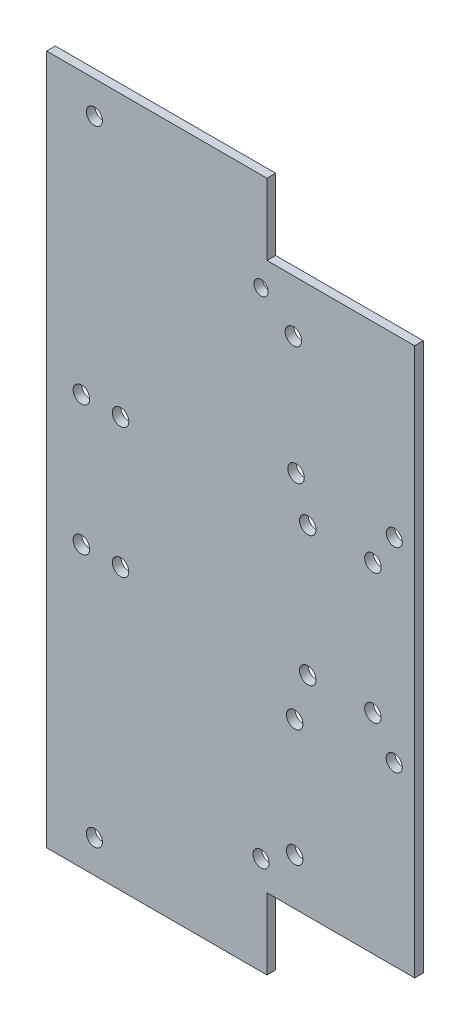
ISO-10303-21;
HEADER;
FILE_DESCRIPTION(('STEP AP214'),'2;1');
FILE_NAME('part.step','',(''),(''),'','','');
FILE_SCHEMA(('AUTOMOTIVE_DESIGN { 1 0 10303 214 1 1 1 1 }'));
ENDSEC;
DATA;
#1=APPLICATION_CONTEXT('core data for automotive mechanical design processes');
#2=APPLICATION_PROTOCOL_DEFINITION('international standard','automotive_design',2000,#1);
#3=PRODUCT_CONTEXT('',#1,'mechanical');
#4=PRODUCT('Part','Part','',(#3));
#5=PRODUCT_RELATED_PRODUCT_CATEGORY('part','',(#4));
#6=PRODUCT_DEFINITION_FORMATION('','',#4);
#7=PRODUCT_DEFINITION_CONTEXT('part definition',#1,'design');
#8=PRODUCT_DEFINITION('design','',#6,#7);
#9=PRODUCT_DEFINITION_SHAPE('','',#8);
#10=(LENGTH_UNIT() NAMED_UNIT(*) SI_UNIT(.MILLI.,.METRE.));
#11=(NAMED_UNIT(*) PLANE_ANGLE_UNIT() SI_UNIT($,.RADIAN.));
#12=(NAMED_UNIT(*) SI_UNIT($,.STERADIAN.) SOLID_ANGLE_UNIT());
#13=UNCERTAINTY_MEASURE_WITH_UNIT(LENGTH_MEASURE(1.E-05),#10,'distance_accuracy_value','');
#14=(GEOMETRIC_REPRESENTATION_CONTEXT(3) GLOBAL_UNCERTAINTY_ASSIGNED_CONTEXT((#13)) GLOBAL_UNIT_ASSIGNED_CONTEXT((#10,
#11,#12)) REPRESENTATION_CONTEXT('',''));
#15=CARTESIAN_POINT('',(0.,0.,0.));
#16=DIRECTION('',(0.,0.,1.));
#17=DIRECTION('',(1.,0.,0.));
#18=AXIS2_PLACEMENT_3D('',#15,#16,#17);
#19=CARTESIAN_POINT('',(0.,0.,2.54));
#20=DIRECTION('',(0.,0.,1.));
#21=DIRECTION('',(1.,0.,0.));
#22=AXIS2_PLACEMENT_3D('',#19,#20,#21);
#23=PLANE('',#22);
#24=DIRECTION('',(0.,-1.,0.));
#25=VECTOR('',#24,1.);
#26=CARTESIAN_POINT('',(-104.617436481074,-66.5367810750292,2.54));
#27=LINE('',#26,#25);
#28=CARTESIAN_POINT('',(-104.617436481074,12.1397189249708,2.54));
#29=VERTEX_POINT('',#28);
#30=CARTESIAN_POINT('',(-104.617436481074,-189.536281075029,2.54));
#31=VERTEX_POINT('',#30);
#32=EDGE_CURVE('E106',#29,#31,#27,.T.);
#33=ORIENTED_EDGE('',*,*,#32,.T.);
#34=DIRECTION('',(1.,0.,0.));
#35=VECTOR('',#34,1.);
#36=CARTESIAN_POINT('',(-143.497061780672,-189.536281075029,2.54));
#37=LINE('',#36,#35);
#38=CARTESIAN_POINT('',(-40.2334284748819,-189.536281075029,2.54));
#39=VERTEX_POINT('',#38);
#40=EDGE_CURVE('E110',#31,#39,#37,.T.);
#41=ORIENTED_EDGE('',*,*,#40,.T.);
#42=DIRECTION('',(0.,-1.,0.));
#43=VECTOR('',#42,1.);
#44=CARTESIAN_POINT('',(-40.2334284748819,-197.669221200133,2.54));
#45=LINE('',#44,#43);
#46=CARTESIAN_POINT('',(-40.2334284748819,-168.708281075029,2.54));
#47=VERTEX_POINT('',#46);
#48=EDGE_CURVE('E163',#47,#39,#45,.T.);
#49=ORIENTED_EDGE('',*,*,#48,.F.);
#50=DIRECTION('',(1.,0.,0.));
#51=VECTOR('',#50,1.);
#52=CARTESIAN_POINT('',(2.93005005933537,-168.708281075029,2.54));
#53=LINE('',#52,#51);
#54=CARTESIAN_POINT('',(2.93005005933537,-168.708281075029,2.54));
#55=VERTEX_POINT('',#54);
#56=EDGE_CURVE('E125',#47,#55,#53,.T.);
#57=ORIENTED_EDGE('',*,*,#56,.T.);
#58=DIRECTION('',(0.,1.,0.));
#59=VECTOR('',#58,1.);
#60=CARTESIAN_POINT('',(2.93005005933537,-168.708281075029,2.54));
#61=LINE('',#60,#59);
#62=CARTESIAN_POINT('',(2.93005005933538,-8.68828107502921,2.54));
#63=VERTEX_POINT('',#62);
#64=EDGE_CURVE('E146',#55,#63,#61,.T.);
#65=ORIENTED_EDGE('',*,*,#64,.T.);
#66=DIRECTION('',(-1.,0.,0.));
#67=VECTOR('',#66,1.);
#68=CARTESIAN_POINT('',(2.93005005933538,-8.68828107502921,2.54));
#69=LINE('',#68,#67);
#70=CARTESIAN_POINT('',(-40.2334284748819,-8.68828107502921,2.54));
#71=VERTEX_POINT('',#70);
#72=EDGE_CURVE('E129',#63,#71,#69,.T.);
#73=ORIENTED_EDGE('',*,*,#72,.T.);
#74=DIRECTION('',(0.,-1.,0.));
#75=VECTOR('',#74,1.);
#76=CARTESIAN_POINT('',(-40.2334284748819,12.425225660702,2.54));
#77=LINE('',#76,#75);
#78=CARTESIAN_POINT('',(-40.2334284748819,12.1397189249708,2.54));
#79=VERTEX_POINT('',#78);
#80=EDGE_CURVE('E170',#79,#71,#77,.T.);
#81=ORIENTED_EDGE('',*,*,#80,.F.);
#82=DIRECTION('',(-1.,0.,0.));
#83=VECTOR('',#82,1.);
#84=CARTESIAN_POINT('',(-143.497061780672,12.1397189249708,2.54));
#85=LINE('',#84,#83);
#86=EDGE_CURVE('E114',#79,#29,#85,.T.);
#87=ORIENTED_EDGE('',*,*,#86,.T.);
#88=EDGE_LOOP('',(#33,#41,#49,#57,#65,#73,#81,#87));
#89=FACE_BOUND('',#88,.T.);
#90=CARTESIAN_POINT('',(-32.1404679928819,-155.071444628745,2.54));
#91=DIRECTION('',(0.,0.,1.));
#92=DIRECTION('',(1.,0.,0.));
#93=AXIS2_PLACEMENT_3D('',#90,#91,#92);
#94=CIRCLE('',#93,2.41300000000001);
#95=CARTESIAN_POINT('',(-29.7274679928819,-155.071444628745,2.54));
#96=VERTEX_POINT('',#95);
#97=EDGE_CURVE('E183',#96,#96,#94,.T.);
#98=ORIENTED_EDGE('',*,*,#97,.F.);
#99=EDGE_LOOP('',(#98));
#100=FACE_BOUND('',#99,.T.);
#101=CARTESIAN_POINT('',(-32.1404679928819,-120.781444628745,2.54));
#102=DIRECTION('',(0.,0.,1.));
#103=DIRECTION('',(1.,0.,0.));
#104=AXIS2_PLACEMENT_3D('',#101,#102,#103);
#105=CIRCLE('',#104,2.413);
#106=CARTESIAN_POINT('',(-29.7274679928819,-120.781444628745,2.54));
#107=VERTEX_POINT('',#106);
#108=EDGE_CURVE('E175',#107,#107,#105,.T.);
#109=ORIENTED_EDGE('',*,*,#108,.F.);
#110=EDGE_LOOP('',(#109));
#111=FACE_BOUND('',#110,.T.);
#112=CARTESIAN_POINT('',(-32.5113958305303,-23.9917810750292,2.54));
#113=DIRECTION('',(0.,0.,1.));
#114=DIRECTION('',(1.,0.,0.));
#115=AXIS2_PLACEMENT_3D('',#112,#113,#114);
#116=CIRCLE('',#115,2.413);
#117=CARTESIAN_POINT('',(-30.0983958305303,-23.9917810750292,2.54));
#118=VERTEX_POINT('',#117);
#119=EDGE_CURVE('E182',#118,#118,#116,.T.);
#120=ORIENTED_EDGE('',*,*,#119,.F.);
#121=EDGE_LOOP('',(#120));
#122=FACE_BOUND('',#121,.T.);
#123=CARTESIAN_POINT('',(-31.7389916341588,-58.2730805217748,2.54));
#124=DIRECTION('',(0.,0.,1.));
#125=DIRECTION('',(1.,0.,0.));
#126=AXIS2_PLACEMENT_3D('',#123,#124,#125);
#127=CIRCLE('',#126,2.41299999999999);
#128=CARTESIAN_POINT('',(-29.3259916341588,-58.2730805217748,2.54));
#129=VERTEX_POINT('',#128);
#130=EDGE_CURVE('E194',#129,#129,#127,.T.);
#131=ORIENTED_EDGE('',*,*,#130,.F.);
#132=EDGE_LOOP('',(#131));
#133=FACE_BOUND('',#132,.T.);
#134=CARTESIAN_POINT('',(-83.0274364810743,-69.7117810750292,2.54));
#135=DIRECTION('',(0.,0.,1.));
#136=DIRECTION('',(1.,0.,0.));
#137=AXIS2_PLACEMENT_3D('',#134,#135,#136);
#138=CIRCLE('',#137,2.41299999999999);
#139=CARTESIAN_POINT('',(-80.6144364810743,-69.7117810750292,2.54));
#140=VERTEX_POINT('',#139);
#141=EDGE_CURVE('E221',#140,#140,#138,.T.);
#142=ORIENTED_EDGE('',*,*,#141,.F.);
#143=EDGE_LOOP('',(#142));
#144=FACE_BOUND('',#143,.T.);
#145=CARTESIAN_POINT('',(-28.3119499406647,-69.7117810750292,2.54));
#146=DIRECTION('',(0.,0.,1.));
#147=DIRECTION('',(1.,0.,0.));
#148=AXIS2_PLACEMENT_3D('',#145,#146,#147);
#149=CIRCLE('',#148,2.413);
#150=CARTESIAN_POINT('',(-25.8989499406647,-69.7117810750292,2.54));
#151=VERTEX_POINT('',#150);
#152=EDGE_CURVE('E228',#151,#151,#149,.T.);
#153=ORIENTED_EDGE('',*,*,#152,.F.);
#154=EDGE_LOOP('',(#153));
#155=FACE_BOUND('',#154,.T.);
#156=CARTESIAN_POINT('',(-9.26194994066465,-69.7117810750292,2.54));
#157=DIRECTION('',(0.,0.,1.));
#158=DIRECTION('',(1.,0.,0.));
#159=AXIS2_PLACEMENT_3D('',#156,#157,#158);
#160=CIRCLE('',#159,2.413);
#161=CARTESIAN_POINT('',(-6.84894994066465,-69.7117810750292,2.54));
#162=VERTEX_POINT('',#161);
#163=EDGE_CURVE('E234',#162,#162,#160,.T.);
#164=ORIENTED_EDGE('',*,*,#163,.F.);
#165=EDGE_LOOP('',(#164));
#166=FACE_BOUND('',#165,.T.);
#167=CARTESIAN_POINT('',(-28.3119499406647,-107.684781075029,2.54));
#168=DIRECTION('',(0.,0.,-1.));
#169=DIRECTION('',(-1.,0.,0.));
#170=AXIS2_PLACEMENT_3D('',#167,#168,#169);
#171=CIRCLE('',#170,2.413);
#172=CARTESIAN_POINT('',(-30.7249499406647,-107.684781075029,2.54));
#173=VERTEX_POINT('',#172);
#174=EDGE_CURVE('E203',#173,#173,#171,.T.);
#175=ORIENTED_EDGE('',*,*,#174,.T.);
#176=EDGE_LOOP('',(#175));
#177=FACE_BOUND('',#176,.T.);
#178=CARTESIAN_POINT('',(-94.4574364810743,-107.684781075029,2.54));
#179=DIRECTION('',(0.,0.,-1.));
#180=DIRECTION('',(-1.,0.,0.));
#181=AXIS2_PLACEMENT_3D('',#178,#179,#180);
#182=CIRCLE('',#181,2.413);
#183=CARTESIAN_POINT('',(-96.8704364810743,-107.684781075029,2.54));
#184=VERTEX_POINT('',#183);
#185=EDGE_CURVE('E216',#184,#184,#182,.T.);
#186=ORIENTED_EDGE('',*,*,#185,.T.);
#187=EDGE_LOOP('',(#186));
#188=FACE_BOUND('',#187,.T.);
#189=CARTESIAN_POINT('',(-94.4574364810743,-69.7117810750292,2.54));
#190=DIRECTION('',(0.,0.,1.));
#191=DIRECTION('',(1.,0.,0.));
#192=AXIS2_PLACEMENT_3D('',#189,#190,#191);
#193=CIRCLE('',#192,2.41299999999999);
#194=CARTESIAN_POINT('',(-92.0444364810743,-69.7117810750292,2.54));
#195=VERTEX_POINT('',#194);
#196=EDGE_CURVE('E224',#195,#195,#193,.T.);
#197=ORIENTED_EDGE('',*,*,#196,.F.);
#198=EDGE_LOOP('',(#197));
#199=FACE_BOUND('',#198,.T.);
#200=CARTESIAN_POINT('',(-3.03506178067245,-60.1867810750292,2.54));
#201=DIRECTION('',(0.,0.,1.));
#202=DIRECTION('',(1.,0.,0.));
#203=AXIS2_PLACEMENT_3D('',#200,#201,#202);
#204=CIRCLE('',#203,2.3495);
#205=CARTESIAN_POINT('',(-0.685561780672452,-60.1867810750292,2.54));
#206=VERTEX_POINT('',#205);
#207=EDGE_CURVE('E255',#206,#206,#204,.T.);
#208=ORIENTED_EDGE('',*,*,#207,.F.);
#209=EDGE_LOOP('',(#208));
#210=FACE_BOUND('',#209,.T.);
#211=CARTESIAN_POINT('',(-90.6739111427951,2.61471892497078,2.54));
#212=DIRECTION('',(0.,0.,1.));
#213=DIRECTION('',(1.,0.,0.));
#214=AXIS2_PLACEMENT_3D('',#211,#212,#213);
#215=CIRCLE('',#214,2.3495);
#216=CARTESIAN_POINT('',(-88.3244111427951,2.61471892497078,2.54));
#217=VERTEX_POINT('',#216);
#218=EDGE_CURVE('E267',#217,#217,#215,.T.);
#219=ORIENTED_EDGE('',*,*,#218,.F.);
#220=EDGE_LOOP('',(#219));
#221=FACE_BOUND('',#220,.T.);
#222=CARTESIAN_POINT('',(-41.9565544799439,-160.961281075029,2.54));
#223=DIRECTION('',(0.,0.,1.));
#224=DIRECTION('',(1.,0.,0.));
#225=AXIS2_PLACEMENT_3D('',#222,#223,#224);
#226=CIRCLE('',#225,2.3495);
#227=CARTESIAN_POINT('',(-39.6070544799439,-160.961281075029,2.54));
#228=VERTEX_POINT('',#227);
#229=EDGE_CURVE('E137',#228,#228,#226,.T.);
#230=ORIENTED_EDGE('',*,*,#229,.F.);
#231=EDGE_LOOP('',(#230));
#232=FACE_BOUND('',#231,.T.);
#233=CARTESIAN_POINT('',(-90.6739111427951,-180.011281075029,2.54));
#234=DIRECTION('',(0.,0.,1.));
#235=DIRECTION('',(1.,0.,0.));
#236=AXIS2_PLACEMENT_3D('',#233,#234,#235);
#237=CIRCLE('',#236,2.34950000000001);
#238=CARTESIAN_POINT('',(-88.3244111427951,-180.011281075029,2.54));
#239=VERTEX_POINT('',#238);
#240=EDGE_CURVE('E273',#239,#239,#237,.T.);
#241=ORIENTED_EDGE('',*,*,#240,.F.);
#242=EDGE_LOOP('',(#241));
#243=FACE_BOUND('',#242,.T.);
#244=CARTESIAN_POINT('',(-3.03506178067245,-117.209781075029,2.54));
#245=DIRECTION('',(0.,0.,1.));
#246=DIRECTION('',(1.,0.,0.));
#247=AXIS2_PLACEMENT_3D('',#244,#245,#246);
#248=CIRCLE('',#247,2.3495);
#249=CARTESIAN_POINT('',(-0.685561780672452,-117.209781075029,2.54));
#250=VERTEX_POINT('',#249);
#251=EDGE_CURVE('E261',#250,#250,#248,.T.);
#252=ORIENTED_EDGE('',*,*,#251,.F.);
#253=EDGE_LOOP('',(#252));
#254=FACE_BOUND('',#253,.T.);
#255=CARTESIAN_POINT('',(-41.9565544799439,-16.4352810750292,2.54));
#256=DIRECTION('',(0.,0.,1.));
#257=DIRECTION('',(1.,0.,0.));
#258=AXIS2_PLACEMENT_3D('',#255,#256,#257);
#259=CIRCLE('',#258,2.0955);
#260=CARTESIAN_POINT('',(-39.8610544799439,-16.4352810750292,2.54));
#261=VERTEX_POINT('',#260);
#262=EDGE_CURVE('E249',#261,#261,#259,.T.);
#263=ORIENTED_EDGE('',*,*,#262,.F.);
#264=EDGE_LOOP('',(#263));
#265=FACE_BOUND('',#264,.T.);
#266=CARTESIAN_POINT('',(-83.0274364810744,-107.684781075029,2.54));
#267=DIRECTION('',(0.,0.,-1.));
#268=DIRECTION('',(-1.,0.,0.));
#269=AXIS2_PLACEMENT_3D('',#266,#267,#268);
#270=CIRCLE('',#269,2.41299999999999);
#271=CARTESIAN_POINT('',(-85.4404364810744,-107.684781075029,2.54));
#272=VERTEX_POINT('',#271);
#273=EDGE_CURVE('E210',#272,#272,#270,.T.);
#274=ORIENTED_EDGE('',*,*,#273,.T.);
#275=EDGE_LOOP('',(#274));
#276=FACE_BOUND('',#275,.T.);
#277=CARTESIAN_POINT('',(-9.26194994066465,-107.684781075029,2.54));
#278=DIRECTION('',(0.,0.,-1.));
#279=DIRECTION('',(-1.,0.,0.));
#280=AXIS2_PLACEMENT_3D('',#277,#278,#279);
#281=CIRCLE('',#280,2.41299999999999);
#282=CARTESIAN_POINT('',(-11.6749499406646,-107.684781075029,2.54));
#283=VERTEX_POINT('',#282);
#284=EDGE_CURVE('E240',#283,#283,#281,.T.);
#285=ORIENTED_EDGE('',*,*,#284,.T.);
#286=EDGE_LOOP('',(#285));
#287=FACE_BOUND('',#286,.T.);
#288=ADVANCED_FACE('F41',(#89,#100,#111,#122,#133,#144,#155,#166,#177,#188,#199,#210,#221,#232,
#243,#254,#265,#276,#287),#23,.T.);
#289=CARTESIAN_POINT('',(0.,0.,0.));
#290=DIRECTION('',(0.,0.,1.));
#291=DIRECTION('',(1.,0.,0.));
#292=AXIS2_PLACEMENT_3D('',#289,#290,#291);
#293=PLANE('',#292);
#294=CARTESIAN_POINT('',(-32.1404679928819,-155.071444628745,0.));
#295=DIRECTION('',(0.,0.,1.));
#296=DIRECTION('',(1.,0.,0.));
#297=AXIS2_PLACEMENT_3D('',#294,#295,#296);
#298=CIRCLE('',#297,2.41300000000001);
#299=CARTESIAN_POINT('',(-29.7274679928819,-155.071444628745,0.));
#300=VERTEX_POINT('',#299);
#301=EDGE_CURVE('E179',#300,#300,#298,.T.);
#302=ORIENTED_EDGE('',*,*,#301,.T.);
#303=EDGE_LOOP('',(#302));
#304=FACE_BOUND('',#303,.T.);
#305=CARTESIAN_POINT('',(-32.1404679928819,-120.781444628745,0.));
#306=DIRECTION('',(0.,0.,1.));
#307=DIRECTION('',(1.,0.,0.));
#308=AXIS2_PLACEMENT_3D('',#305,#306,#307);
#309=CIRCLE('',#308,2.413);
#310=CARTESIAN_POINT('',(-29.7274679928819,-120.781444628745,0.));
#311=VERTEX_POINT('',#310);
#312=EDGE_CURVE('E186',#311,#311,#309,.T.);
#313=ORIENTED_EDGE('',*,*,#312,.T.);
#314=EDGE_LOOP('',(#313));
#315=FACE_BOUND('',#314,.T.);
#316=CARTESIAN_POINT('',(-32.5113958305303,-23.9917810750292,0.));
#317=DIRECTION('',(0.,0.,1.));
#318=DIRECTION('',(1.,0.,0.));
#319=AXIS2_PLACEMENT_3D('',#316,#317,#318);
#320=CIRCLE('',#319,2.413);
#321=CARTESIAN_POINT('',(-30.0983958305303,-23.9917810750292,0.));
#322=VERTEX_POINT('',#321);
#323=EDGE_CURVE('E191',#322,#322,#320,.T.);
#324=ORIENTED_EDGE('',*,*,#323,.T.);
#325=EDGE_LOOP('',(#324));
#326=FACE_BOUND('',#325,.T.);
#327=CARTESIAN_POINT('',(-31.7389916341588,-58.2730805217748,0.));
#328=DIRECTION('',(0.,0.,1.));
#329=DIRECTION('',(1.,0.,0.));
#330=AXIS2_PLACEMENT_3D('',#327,#328,#329);
#331=CIRCLE('',#330,2.41299999999999);
#332=CARTESIAN_POINT('',(-29.3259916341588,-58.2730805217748,0.));
#333=VERTEX_POINT('',#332);
#334=EDGE_CURVE('E197',#333,#333,#331,.T.);
#335=ORIENTED_EDGE('',*,*,#334,.T.);
#336=EDGE_LOOP('',(#335));
#337=FACE_BOUND('',#336,.T.);
#338=CARTESIAN_POINT('',(-83.0274364810743,-69.7117810750292,0.));
#339=DIRECTION('',(0.,0.,1.));
#340=DIRECTION('',(1.,0.,0.));
#341=AXIS2_PLACEMENT_3D('',#338,#339,#340);
#342=CIRCLE('',#341,2.41299999999999);
#343=CARTESIAN_POINT('',(-80.6144364810743,-69.7117810750292,0.));
#344=VERTEX_POINT('',#343);
#345=EDGE_CURVE('E225',#344,#344,#342,.T.);
#346=ORIENTED_EDGE('',*,*,#345,.T.);
#347=EDGE_LOOP('',(#346));
#348=FACE_BOUND('',#347,.T.);
#349=CARTESIAN_POINT('',(-28.3119499406647,-69.7117810750292,0.));
#350=DIRECTION('',(0.,0.,1.));
#351=DIRECTION('',(1.,0.,0.));
#352=AXIS2_PLACEMENT_3D('',#349,#350,#351);
#353=CIRCLE('',#352,2.413);
#354=CARTESIAN_POINT('',(-25.8989499406647,-69.7117810750292,0.));
#355=VERTEX_POINT('',#354);
#356=EDGE_CURVE('E231',#355,#355,#353,.T.);
#357=ORIENTED_EDGE('',*,*,#356,.T.);
#358=EDGE_LOOP('',(#357));
#359=FACE_BOUND('',#358,.T.);
#360=CARTESIAN_POINT('',(-9.26194994066465,-69.7117810750292,0.));
#361=DIRECTION('',(0.,0.,1.));
#362=DIRECTION('',(1.,0.,0.));
#363=AXIS2_PLACEMENT_3D('',#360,#361,#362);
#364=CIRCLE('',#363,2.413);
#365=CARTESIAN_POINT('',(-6.84894994066465,-69.7117810750292,0.));
#366=VERTEX_POINT('',#365);
#367=EDGE_CURVE('E237',#366,#366,#364,.T.);
#368=ORIENTED_EDGE('',*,*,#367,.T.);
#369=EDGE_LOOP('',(#368));
#370=FACE_BOUND('',#369,.T.);
#371=CARTESIAN_POINT('',(-94.4574364810743,-69.7117810750292,0.));
#372=DIRECTION('',(0.,0.,1.));
#373=DIRECTION('',(1.,0.,0.));
#374=AXIS2_PLACEMENT_3D('',#371,#372,#373);
#375=CIRCLE('',#374,2.41299999999999);
#376=CARTESIAN_POINT('',(-92.0444364810743,-69.7117810750292,0.));
#377=VERTEX_POINT('',#376);
#378=EDGE_CURVE('E116',#377,#377,#375,.T.);
#379=ORIENTED_EDGE('',*,*,#378,.T.);
#380=EDGE_LOOP('',(#379));
#381=FACE_BOUND('',#380,.T.);
#382=DIRECTION('',(1.,0.,0.));
#383=VECTOR('',#382,1.);
#384=CARTESIAN_POINT('',(-143.497061780672,-189.536281075029,0.));
#385=LINE('',#384,#383);
#386=CARTESIAN_POINT('',(-104.617436481074,-189.536281075029,0.));
#387=VERTEX_POINT('',#386);
#388=CARTESIAN_POINT('',(-40.2334284748819,-189.536281075029,0.));
#389=VERTEX_POINT('',#388);
#390=EDGE_CURVE('E142',#387,#389,#385,.T.);
#391=ORIENTED_EDGE('',*,*,#390,.F.);
#392=DIRECTION('',(0.,1.,0.));
#393=VECTOR('',#392,1.);
#394=CARTESIAN_POINT('',(-104.617436481074,-66.5367810750292,0.));
#395=LINE('',#394,#393);
#396=CARTESIAN_POINT('',(-104.617436481074,12.1397189249708,0.));
#397=VERTEX_POINT('',#396);
#398=EDGE_CURVE('E56',#387,#397,#395,.T.);
#399=ORIENTED_EDGE('',*,*,#398,.T.);
#400=DIRECTION('',(-1.,0.,0.));
#401=VECTOR('',#400,1.);
#402=CARTESIAN_POINT('',(-143.497061780672,12.1397189249708,0.));
#403=LINE('',#402,#401);
#404=CARTESIAN_POINT('',(-40.2334284748819,12.1397189249708,0.));
#405=VERTEX_POINT('',#404);
#406=EDGE_CURVE('E139',#405,#397,#403,.T.);
#407=ORIENTED_EDGE('',*,*,#406,.F.);
#408=DIRECTION('',(0.,-1.,0.));
#409=VECTOR('',#408,1.);
#410=CARTESIAN_POINT('',(-40.2334284748819,12.425225660702,0.));
#411=LINE('',#410,#409);
#412=CARTESIAN_POINT('',(-40.2334284748819,-8.68828107502921,0.));
#413=VERTEX_POINT('',#412);
#414=EDGE_CURVE('E63',#405,#413,#411,.T.);
#415=ORIENTED_EDGE('',*,*,#414,.T.);
#416=DIRECTION('',(-1.,0.,0.));
#417=VECTOR('',#416,1.);
#418=CARTESIAN_POINT('',(2.93005005933538,-8.68828107502921,0.));
#419=LINE('',#418,#417);
#420=CARTESIAN_POINT('',(2.93005005933538,-8.68828107502921,0.));
#421=VERTEX_POINT('',#420);
#422=EDGE_CURVE('E136',#421,#413,#419,.T.);
#423=ORIENTED_EDGE('',*,*,#422,.F.);
#424=DIRECTION('',(0.,1.,0.));
#425=VECTOR('',#424,1.);
#426=CARTESIAN_POINT('',(2.93005005933537,-168.708281075029,0.));
#427=LINE('',#426,#425);
#428=CARTESIAN_POINT('',(2.93005005933537,-168.708281075029,0.));
#429=VERTEX_POINT('',#428);
#430=EDGE_CURVE('E133',#429,#421,#427,.T.);
#431=ORIENTED_EDGE('',*,*,#430,.F.);
#432=DIRECTION('',(1.,0.,0.));
#433=VECTOR('',#432,1.);
#434=CARTESIAN_POINT('',(2.93005005933537,-168.708281075029,0.));
#435=LINE('',#434,#433);
#436=CARTESIAN_POINT('',(-40.2334284748819,-168.708281075029,0.));
#437=VERTEX_POINT('',#436);
#438=EDGE_CURVE('E144',#437,#429,#435,.T.);
#439=ORIENTED_EDGE('',*,*,#438,.F.);
#440=DIRECTION('',(0.,-1.,0.));
#441=VECTOR('',#440,1.);
#442=CARTESIAN_POINT('',(-40.2334284748819,-197.669221200133,0.));
#443=LINE('',#442,#441);
#444=EDGE_CURVE('E165',#437,#389,#443,.T.);
#445=ORIENTED_EDGE('',*,*,#444,.T.);
#446=EDGE_LOOP('',(#391,#399,#407,#415,#423,#431,#439,#445));
#447=FACE_BOUND('',#446,.T.);
#448=CARTESIAN_POINT('',(-41.9565544799439,-160.961281075029,0.));
#449=DIRECTION('',(0.,0.,1.));
#450=DIRECTION('',(1.,0.,0.));
#451=AXIS2_PLACEMENT_3D('',#448,#449,#450);
#452=CIRCLE('',#451,2.3495);
#453=CARTESIAN_POINT('',(-39.6070544799439,-160.961281075029,0.));
#454=VERTEX_POINT('',#453);
#455=EDGE_CURVE('E276',#454,#454,#452,.T.);
#456=ORIENTED_EDGE('',*,*,#455,.T.);
#457=EDGE_LOOP('',(#456));
#458=FACE_BOUND('',#457,.T.);
#459=CARTESIAN_POINT('',(-90.6739111427951,-180.011281075029,0.));
#460=DIRECTION('',(0.,0.,1.));
#461=DIRECTION('',(1.,0.,0.));
#462=AXIS2_PLACEMENT_3D('',#459,#460,#461);
#463=CIRCLE('',#462,2.34950000000001);
#464=CARTESIAN_POINT('',(-88.3244111427951,-180.011281075029,0.));
#465=VERTEX_POINT('',#464);
#466=EDGE_CURVE('E270',#465,#465,#463,.T.);
#467=ORIENTED_EDGE('',*,*,#466,.T.);
#468=EDGE_LOOP('',(#467));
#469=FACE_BOUND('',#468,.T.);
#470=CARTESIAN_POINT('',(-90.6739111427951,2.61471892497078,0.));
#471=DIRECTION('',(0.,0.,1.));
#472=DIRECTION('',(1.,0.,0.));
#473=AXIS2_PLACEMENT_3D('',#470,#471,#472);
#474=CIRCLE('',#473,2.3495);
#475=CARTESIAN_POINT('',(-88.3244111427951,2.61471892497078,0.));
#476=VERTEX_POINT('',#475);
#477=EDGE_CURVE('E264',#476,#476,#474,.T.);
#478=ORIENTED_EDGE('',*,*,#477,.T.);
#479=EDGE_LOOP('',(#478));
#480=FACE_BOUND('',#479,.T.);
#481=CARTESIAN_POINT('',(-3.03506178067245,-117.209781075029,0.));
#482=DIRECTION('',(0.,0.,1.));
#483=DIRECTION('',(1.,0.,0.));
#484=AXIS2_PLACEMENT_3D('',#481,#482,#483);
#485=CIRCLE('',#484,2.3495);
#486=CARTESIAN_POINT('',(-0.685561780672452,-117.209781075029,0.));
#487=VERTEX_POINT('',#486);
#488=EDGE_CURVE('E258',#487,#487,#485,.T.);
#489=ORIENTED_EDGE('',*,*,#488,.T.);
#490=EDGE_LOOP('',(#489));
#491=FACE_BOUND('',#490,.T.);
#492=CARTESIAN_POINT('',(-3.03506178067245,-60.1867810750292,0.));
#493=DIRECTION('',(0.,0.,1.));
#494=DIRECTION('',(1.,0.,0.));
#495=AXIS2_PLACEMENT_3D('',#492,#493,#494);
#496=CIRCLE('',#495,2.3495);
#497=CARTESIAN_POINT('',(-0.685561780672452,-60.1867810750292,0.));
#498=VERTEX_POINT('',#497);
#499=EDGE_CURVE('E252',#498,#498,#496,.T.);
#500=ORIENTED_EDGE('',*,*,#499,.T.);
#501=EDGE_LOOP('',(#500));
#502=FACE_BOUND('',#501,.T.);
#503=CARTESIAN_POINT('',(-41.9565544799439,-16.4352810750292,0.));
#504=DIRECTION('',(0.,0.,1.));
#505=DIRECTION('',(1.,0.,0.));
#506=AXIS2_PLACEMENT_3D('',#503,#504,#505);
#507=CIRCLE('',#506,2.0955);
#508=CARTESIAN_POINT('',(-39.8610544799439,-16.4352810750292,0.));
#509=VERTEX_POINT('',#508);
#510=EDGE_CURVE('E160',#509,#509,#507,.T.);
#511=ORIENTED_EDGE('',*,*,#510,.T.);
#512=EDGE_LOOP('',(#511));
#513=FACE_BOUND('',#512,.T.);
#514=CARTESIAN_POINT('',(-94.4574364810743,-107.684781075029,0.));
#515=DIRECTION('',(0.,0.,-1.));
#516=DIRECTION('',(-1.,0.,0.));
#517=AXIS2_PLACEMENT_3D('',#514,#515,#516);
#518=CIRCLE('',#517,2.413);
#519=CARTESIAN_POINT('',(-96.8704364810743,-107.684781075029,0.));
#520=VERTEX_POINT('',#519);
#521=EDGE_CURVE('E200',#520,#520,#518,.T.);
#522=ORIENTED_EDGE('',*,*,#521,.F.);
#523=EDGE_LOOP('',(#522));
#524=FACE_BOUND('',#523,.T.);
#525=CARTESIAN_POINT('',(-83.0274364810744,-107.684781075029,0.));
#526=DIRECTION('',(0.,0.,-1.));
#527=DIRECTION('',(-1.,0.,0.));
#528=AXIS2_PLACEMENT_3D('',#525,#526,#527);
#529=CIRCLE('',#528,2.41299999999999);
#530=CARTESIAN_POINT('',(-85.4404364810744,-107.684781075029,0.));
#531=VERTEX_POINT('',#530);
#532=EDGE_CURVE('E213',#531,#531,#529,.T.);
#533=ORIENTED_EDGE('',*,*,#532,.F.);
#534=EDGE_LOOP('',(#533));
#535=FACE_BOUND('',#534,.T.);
#536=CARTESIAN_POINT('',(-28.3119499406647,-107.684781075029,0.));
#537=DIRECTION('',(0.,0.,-1.));
#538=DIRECTION('',(-1.,0.,0.));
#539=AXIS2_PLACEMENT_3D('',#536,#537,#538);
#540=CIRCLE('',#539,2.413);
#541=CARTESIAN_POINT('',(-30.7249499406647,-107.684781075029,0.));
#542=VERTEX_POINT('',#541);
#543=EDGE_CURVE('E207',#542,#542,#540,.T.);
#544=ORIENTED_EDGE('',*,*,#543,.F.);
#545=EDGE_LOOP('',(#544));
#546=FACE_BOUND('',#545,.T.);
#547=CARTESIAN_POINT('',(-9.26194994066465,-107.684781075029,0.));
#548=DIRECTION('',(0.,0.,-1.));
#549=DIRECTION('',(-1.,0.,0.));
#550=AXIS2_PLACEMENT_3D('',#547,#548,#549);
#551=CIRCLE('',#550,2.41299999999999);
#552=CARTESIAN_POINT('',(-11.6749499406646,-107.684781075029,0.));
#553=VERTEX_POINT('',#552);
#554=EDGE_CURVE('E206',#553,#553,#551,.T.);
#555=ORIENTED_EDGE('',*,*,#554,.F.);
#556=EDGE_LOOP('',(#555));
#557=FACE_BOUND('',#556,.T.);
#558=ADVANCED_FACE('F157',(#304,#315,#326,#337,#348,#359,#370,#381,#447,#458,#469,#480,#491,
#502,#513,#524,#535,#546,#557),#293,.F.);
#559=CARTESIAN_POINT('',(2.93005005933537,-168.708281075029,2.54));
#560=DIRECTION('',(-1.,0.,0.));
#561=DIRECTION('',(0.,-1.,0.));
#562=AXIS2_PLACEMENT_3D('',#559,#560,#561);
#563=PLANE('',#562);
#564=ORIENTED_EDGE('',*,*,#430,.T.);
#565=DIRECTION('',(0.,0.,-1.));
#566=VECTOR('',#565,1.);
#567=CARTESIAN_POINT('',(2.93005005933538,-8.68828107502921,2.54));
#568=LINE('',#567,#566);
#569=EDGE_CURVE('E149',#63,#421,#568,.T.);
#570=ORIENTED_EDGE('',*,*,#569,.F.);
#571=ORIENTED_EDGE('',*,*,#64,.F.);
#572=DIRECTION('',(0.,0.,-1.));
#573=VECTOR('',#572,1.);
#574=CARTESIAN_POINT('',(2.93005005933537,-168.708281075029,2.54));
#575=LINE('',#574,#573);
#576=EDGE_CURVE('E127',#55,#429,#575,.T.);
#577=ORIENTED_EDGE('',*,*,#576,.T.);
#578=EDGE_LOOP('',(#564,#570,#571,#577));
#579=FACE_BOUND('',#578,.T.);
#580=ADVANCED_FACE('F43',(#579),#563,.F.);
#581=CARTESIAN_POINT('',(2.93005005933538,-8.68828107502921,2.54));
#582=DIRECTION('',(0.,-1.,0.));
#583=DIRECTION('',(1.,0.,0.));
#584=AXIS2_PLACEMENT_3D('',#581,#582,#583);
#585=PLANE('',#584);
#586=ORIENTED_EDGE('',*,*,#422,.T.);
#587=DIRECTION('',(0.,0.,1.));
#588=VECTOR('',#587,1.);
#589=CARTESIAN_POINT('',(-40.2334284748819,-8.68828107502921,0.));
#590=LINE('',#589,#588);
#591=EDGE_CURVE('E169',#413,#71,#590,.T.);
#592=ORIENTED_EDGE('',*,*,#591,.T.);
#593=ORIENTED_EDGE('',*,*,#72,.F.);
#594=ORIENTED_EDGE('',*,*,#569,.T.);
#595=EDGE_LOOP('',(#586,#592,#593,#594));
#596=FACE_BOUND('',#595,.T.);
#597=ADVANCED_FACE('F288',(#596),#585,.F.);
#598=CARTESIAN_POINT('',(-143.497061780672,12.1397189249708,2.54));
#599=DIRECTION('',(0.,-1.,0.));
#600=DIRECTION('',(1.,0.,0.));
#601=AXIS2_PLACEMENT_3D('',#598,#599,#600);
#602=PLANE('',#601);
#603=ORIENTED_EDGE('',*,*,#406,.T.);
#604=DIRECTION('',(0.,0.,1.));
#605=VECTOR('',#604,1.);
#606=CARTESIAN_POINT('',(-104.617436481074,12.1397189249708,2.54));
#607=LINE('',#606,#605);
#608=EDGE_CURVE('E162',#397,#29,#607,.T.);
#609=ORIENTED_EDGE('',*,*,#608,.T.);
#610=ORIENTED_EDGE('',*,*,#86,.F.);
#611=DIRECTION('',(0.,0.,-1.));
#612=VECTOR('',#611,1.);
#613=CARTESIAN_POINT('',(-40.2334284748819,12.1397189249708,2.54));
#614=LINE('',#613,#612);
#615=EDGE_CURVE('E49',#79,#405,#614,.T.);
#616=ORIENTED_EDGE('',*,*,#615,.T.);
#617=EDGE_LOOP('',(#603,#609,#610,#616));
#618=FACE_BOUND('',#617,.T.);
#619=ADVANCED_FACE('F154',(#618),#602,.F.);
#620=CARTESIAN_POINT('',(-143.497061780672,-189.536281075029,2.54));
#621=DIRECTION('',(0.,1.,0.));
#622=DIRECTION('',(0.,0.,1.));
#623=AXIS2_PLACEMENT_3D('',#620,#621,#622);
#624=PLANE('',#623);
#625=ORIENTED_EDGE('',*,*,#40,.F.);
#626=DIRECTION('',(0.,0.,-1.));
#627=VECTOR('',#626,1.);
#628=CARTESIAN_POINT('',(-104.617436481074,-189.536281075029,2.54));
#629=LINE('',#628,#627);
#630=EDGE_CURVE('E11',#31,#387,#629,.T.);
#631=ORIENTED_EDGE('',*,*,#630,.T.);
#632=ORIENTED_EDGE('',*,*,#390,.T.);
#633=DIRECTION('',(0.,0.,1.));
#634=VECTOR('',#633,1.);
#635=CARTESIAN_POINT('',(-40.2334284748819,-189.536281075029,2.54));
#636=LINE('',#635,#634);
#637=EDGE_CURVE('E124',#389,#39,#636,.T.);
#638=ORIENTED_EDGE('',*,*,#637,.T.);
#639=EDGE_LOOP('',(#625,#631,#632,#638));
#640=FACE_BOUND('',#639,.T.);
#641=ADVANCED_FACE('F122',(#640),#624,.F.);
#642=CARTESIAN_POINT('',(2.93005005933537,-168.708281075029,2.54));
#643=DIRECTION('',(0.,1.,0.));
#644=DIRECTION('',(-1.,0.,0.));
#645=AXIS2_PLACEMENT_3D('',#642,#643,#644);
#646=PLANE('',#645);
#647=ORIENTED_EDGE('',*,*,#576,.F.);
#648=ORIENTED_EDGE('',*,*,#56,.F.);
#649=DIRECTION('',(0.,0.,1.));
#650=VECTOR('',#649,1.);
#651=CARTESIAN_POINT('',(-40.2334284748819,-168.708281075029,0.));
#652=LINE('',#651,#650);
#653=EDGE_CURVE('E172',#437,#47,#652,.T.);
#654=ORIENTED_EDGE('',*,*,#653,.F.);
#655=ORIENTED_EDGE('',*,*,#438,.T.);
#656=EDGE_LOOP('',(#647,#648,#654,#655));
#657=FACE_BOUND('',#656,.T.);
#658=ADVANCED_FACE('F294',(#657),#646,.F.);
#659=CARTESIAN_POINT('',(-41.9565544799439,-160.961281075029,2.54));
#660=DIRECTION('',(0.,0.,-1.));
#661=DIRECTION('',(-1.,0.,0.));
#662=AXIS2_PLACEMENT_3D('',#659,#660,#661);
#663=CYLINDRICAL_SURFACE('',#662,2.3495);
#664=ORIENTED_EDGE('',*,*,#229,.T.);
#665=EDGE_LOOP('',(#664));
#666=FACE_BOUND('',#665,.T.);
#667=ORIENTED_EDGE('',*,*,#455,.F.);
#668=EDGE_LOOP('',(#667));
#669=FACE_BOUND('',#668,.T.);
#670=ADVANCED_FACE('F318',(#666,#669),#663,.F.);
#671=CARTESIAN_POINT('',(-90.6739111427951,-180.011281075029,2.54));
#672=DIRECTION('',(0.,0.,-1.));
#673=DIRECTION('',(-1.,0.,0.));
#674=AXIS2_PLACEMENT_3D('',#671,#672,#673);
#675=CYLINDRICAL_SURFACE('',#674,2.34950000000001);
#676=ORIENTED_EDGE('',*,*,#240,.T.);
#677=EDGE_LOOP('',(#676));
#678=FACE_BOUND('',#677,.T.);
#679=ORIENTED_EDGE('',*,*,#466,.F.);
#680=EDGE_LOOP('',(#679));
#681=FACE_BOUND('',#680,.T.);
#682=ADVANCED_FACE('F508',(#678,#681),#675,.F.);
#683=CARTESIAN_POINT('',(-90.6739111427951,2.61471892497078,2.54));
#684=DIRECTION('',(0.,0.,-1.));
#685=DIRECTION('',(-1.,0.,0.));
#686=AXIS2_PLACEMENT_3D('',#683,#684,#685);
#687=CYLINDRICAL_SURFACE('',#686,2.3495);
#688=ORIENTED_EDGE('',*,*,#218,.T.);
#689=EDGE_LOOP('',(#688));
#690=FACE_BOUND('',#689,.T.);
#691=ORIENTED_EDGE('',*,*,#477,.F.);
#692=EDGE_LOOP('',(#691));
#693=FACE_BOUND('',#692,.T.);
#694=ADVANCED_FACE('F514',(#690,#693),#687,.F.);
#695=CARTESIAN_POINT('',(-3.03506178067245,-117.209781075029,2.54));
#696=DIRECTION('',(0.,0.,-1.));
#697=DIRECTION('',(-1.,0.,0.));
#698=AXIS2_PLACEMENT_3D('',#695,#696,#697);
#699=CYLINDRICAL_SURFACE('',#698,2.3495);
#700=ORIENTED_EDGE('',*,*,#251,.T.);
#701=EDGE_LOOP('',(#700));
#702=FACE_BOUND('',#701,.T.);
#703=ORIENTED_EDGE('',*,*,#488,.F.);
#704=EDGE_LOOP('',(#703));
#705=FACE_BOUND('',#704,.T.);
#706=ADVANCED_FACE('F521',(#702,#705),#699,.F.);
#707=CARTESIAN_POINT('',(-3.03506178067245,-60.1867810750292,2.54));
#708=DIRECTION('',(0.,0.,-1.));
#709=DIRECTION('',(-1.,0.,0.));
#710=AXIS2_PLACEMENT_3D('',#707,#708,#709);
#711=CYLINDRICAL_SURFACE('',#710,2.3495);
#712=ORIENTED_EDGE('',*,*,#207,.T.);
#713=EDGE_LOOP('',(#712));
#714=FACE_BOUND('',#713,.T.);
#715=ORIENTED_EDGE('',*,*,#499,.F.);
#716=EDGE_LOOP('',(#715));
#717=FACE_BOUND('',#716,.T.);
#718=ADVANCED_FACE('F529',(#714,#717),#711,.F.);
#719=CARTESIAN_POINT('',(-41.9565544799439,-16.4352810750292,2.54));
#720=DIRECTION('',(0.,0.,-1.));
#721=DIRECTION('',(-1.,0.,0.));
#722=AXIS2_PLACEMENT_3D('',#719,#720,#721);
#723=CYLINDRICAL_SURFACE('',#722,2.0955);
#724=ORIENTED_EDGE('',*,*,#262,.T.);
#725=EDGE_LOOP('',(#724));
#726=FACE_BOUND('',#725,.T.);
#727=ORIENTED_EDGE('',*,*,#510,.F.);
#728=EDGE_LOOP('',(#727));
#729=FACE_BOUND('',#728,.T.);
#730=ADVANCED_FACE('F486',(#726,#729),#723,.F.);
#731=CARTESIAN_POINT('',(-104.617436481074,-66.5367810750292,-54.521471265915));
#732=DIRECTION('',(-1.,0.,0.));
#733=DIRECTION('',(0.,0.,1.));
#734=AXIS2_PLACEMENT_3D('',#731,#732,#733);
#735=PLANE('',#734);
#736=ORIENTED_EDGE('',*,*,#398,.F.);
#737=ORIENTED_EDGE('',*,*,#630,.F.);
#738=ORIENTED_EDGE('',*,*,#32,.F.);
#739=ORIENTED_EDGE('',*,*,#608,.F.);
#740=EDGE_LOOP('',(#736,#737,#738,#739));
#741=FACE_BOUND('',#740,.T.);
#742=ADVANCED_FACE('F118',(#741),#735,.T.);
#743=CARTESIAN_POINT('',(-94.4574364810743,-69.7117810750292,0.));
#744=DIRECTION('',(0.,0.,1.));
#745=DIRECTION('',(1.,0.,0.));
#746=AXIS2_PLACEMENT_3D('',#743,#744,#745);
#747=CYLINDRICAL_SURFACE('',#746,2.41299999999999);
#748=ORIENTED_EDGE('',*,*,#378,.F.);
#749=EDGE_LOOP('',(#748));
#750=FACE_BOUND('',#749,.T.);
#751=ORIENTED_EDGE('',*,*,#196,.T.);
#752=EDGE_LOOP('',(#751));
#753=FACE_BOUND('',#752,.T.);
#754=ADVANCED_FACE('F351',(#750,#753),#747,.F.);
#755=CARTESIAN_POINT('',(-94.4574364810743,-107.684781075029,0.));
#756=DIRECTION('',(0.,0.,1.));
#757=DIRECTION('',(1.,0.,0.));
#758=AXIS2_PLACEMENT_3D('',#755,#756,#757);
#759=CYLINDRICAL_SURFACE('',#758,2.413);
#760=ORIENTED_EDGE('',*,*,#521,.T.);
#761=EDGE_LOOP('',(#760));
#762=FACE_BOUND('',#761,.T.);
#763=ORIENTED_EDGE('',*,*,#185,.F.);
#764=EDGE_LOOP('',(#763));
#765=FACE_BOUND('',#764,.T.);
#766=ADVANCED_FACE('F357',(#762,#765),#759,.F.);
#767=CARTESIAN_POINT('',(-83.0274364810744,-107.684781075029,0.));
#768=DIRECTION('',(0.,0.,1.));
#769=DIRECTION('',(1.,0.,0.));
#770=AXIS2_PLACEMENT_3D('',#767,#768,#769);
#771=CYLINDRICAL_SURFACE('',#770,2.41299999999999);
#772=ORIENTED_EDGE('',*,*,#532,.T.);
#773=EDGE_LOOP('',(#772));
#774=FACE_BOUND('',#773,.T.);
#775=ORIENTED_EDGE('',*,*,#273,.F.);
#776=EDGE_LOOP('',(#775));
#777=FACE_BOUND('',#776,.T.);
#778=ADVANCED_FACE('F367',(#774,#777),#771,.F.);
#779=CARTESIAN_POINT('',(-28.3119499406647,-107.684781075029,0.));
#780=DIRECTION('',(0.,0.,1.));
#781=DIRECTION('',(1.,0.,0.));
#782=AXIS2_PLACEMENT_3D('',#779,#780,#781);
#783=CYLINDRICAL_SURFACE('',#782,2.413);
#784=ORIENTED_EDGE('',*,*,#543,.T.);
#785=EDGE_LOOP('',(#784));
#786=FACE_BOUND('',#785,.T.);
#787=ORIENTED_EDGE('',*,*,#174,.F.);
#788=EDGE_LOOP('',(#787));
#789=FACE_BOUND('',#788,.T.);
#790=ADVANCED_FACE('F376',(#786,#789),#783,.F.);
#791=CARTESIAN_POINT('',(-9.26194994066465,-107.684781075029,0.));
#792=DIRECTION('',(0.,0.,1.));
#793=DIRECTION('',(1.,0.,0.));
#794=AXIS2_PLACEMENT_3D('',#791,#792,#793);
#795=CYLINDRICAL_SURFACE('',#794,2.41299999999999);
#796=ORIENTED_EDGE('',*,*,#554,.T.);
#797=EDGE_LOOP('',(#796));
#798=FACE_BOUND('',#797,.T.);
#799=ORIENTED_EDGE('',*,*,#284,.F.);
#800=EDGE_LOOP('',(#799));
#801=FACE_BOUND('',#800,.T.);
#802=ADVANCED_FACE('F385',(#798,#801),#795,.F.);
#803=CARTESIAN_POINT('',(-9.26194994066465,-69.7117810750292,0.));
#804=DIRECTION('',(0.,0.,1.));
#805=DIRECTION('',(1.,0.,0.));
#806=AXIS2_PLACEMENT_3D('',#803,#804,#805);
#807=CYLINDRICAL_SURFACE('',#806,2.413);
#808=ORIENTED_EDGE('',*,*,#367,.F.);
#809=EDGE_LOOP('',(#808));
#810=FACE_BOUND('',#809,.T.);
#811=ORIENTED_EDGE('',*,*,#163,.T.);
#812=EDGE_LOOP('',(#811));
#813=FACE_BOUND('',#812,.T.);
#814=ADVANCED_FACE('F394',(#810,#813),#807,.F.);
#815=CARTESIAN_POINT('',(-28.3119499406647,-69.7117810750292,0.));
#816=DIRECTION('',(0.,0.,1.));
#817=DIRECTION('',(1.,0.,0.));
#818=AXIS2_PLACEMENT_3D('',#815,#816,#817);
#819=CYLINDRICAL_SURFACE('',#818,2.413);
#820=ORIENTED_EDGE('',*,*,#356,.F.);
#821=EDGE_LOOP('',(#820));
#822=FACE_BOUND('',#821,.T.);
#823=ORIENTED_EDGE('',*,*,#152,.T.);
#824=EDGE_LOOP('',(#823));
#825=FACE_BOUND('',#824,.T.);
#826=ADVANCED_FACE('F403',(#822,#825),#819,.F.);
#827=CARTESIAN_POINT('',(-83.0274364810743,-69.7117810750292,0.));
#828=DIRECTION('',(0.,0.,1.));
#829=DIRECTION('',(1.,0.,0.));
#830=AXIS2_PLACEMENT_3D('',#827,#828,#829);
#831=CYLINDRICAL_SURFACE('',#830,2.41299999999999);
#832=ORIENTED_EDGE('',*,*,#345,.F.);
#833=EDGE_LOOP('',(#832));
#834=FACE_BOUND('',#833,.T.);
#835=ORIENTED_EDGE('',*,*,#141,.T.);
#836=EDGE_LOOP('',(#835));
#837=FACE_BOUND('',#836,.T.);
#838=ADVANCED_FACE('F412',(#834,#837),#831,.F.);
#839=CARTESIAN_POINT('',(-31.7389916341588,-58.2730805217748,0.));
#840=DIRECTION('',(0.,0.,1.));
#841=DIRECTION('',(1.,0.,0.));
#842=AXIS2_PLACEMENT_3D('',#839,#840,#841);
#843=CYLINDRICAL_SURFACE('',#842,2.41299999999999);
#844=ORIENTED_EDGE('',*,*,#334,.F.);
#845=EDGE_LOOP('',(#844));
#846=FACE_BOUND('',#845,.T.);
#847=ORIENTED_EDGE('',*,*,#130,.T.);
#848=EDGE_LOOP('',(#847));
#849=FACE_BOUND('',#848,.T.);
#850=ADVANCED_FACE('F421',(#846,#849),#843,.F.);
#851=CARTESIAN_POINT('',(-32.5113958305303,-23.9917810750292,0.));
#852=DIRECTION('',(0.,0.,1.));
#853=DIRECTION('',(1.,0.,0.));
#854=AXIS2_PLACEMENT_3D('',#851,#852,#853);
#855=CYLINDRICAL_SURFACE('',#854,2.413);
#856=ORIENTED_EDGE('',*,*,#323,.F.);
#857=EDGE_LOOP('',(#856));
#858=FACE_BOUND('',#857,.T.);
#859=ORIENTED_EDGE('',*,*,#119,.T.);
#860=EDGE_LOOP('',(#859));
#861=FACE_BOUND('',#860,.T.);
#862=ADVANCED_FACE('F430',(#858,#861),#855,.F.);
#863=CARTESIAN_POINT('',(-32.1404679928819,-120.781444628745,0.));
#864=DIRECTION('',(0.,0.,1.));
#865=DIRECTION('',(1.,0.,0.));
#866=AXIS2_PLACEMENT_3D('',#863,#864,#865);
#867=CYLINDRICAL_SURFACE('',#866,2.413);
#868=ORIENTED_EDGE('',*,*,#312,.F.);
#869=EDGE_LOOP('',(#868));
#870=FACE_BOUND('',#869,.T.);
#871=ORIENTED_EDGE('',*,*,#108,.T.);
#872=EDGE_LOOP('',(#871));
#873=FACE_BOUND('',#872,.T.);
#874=ADVANCED_FACE('F306',(#870,#873),#867,.F.);
#875=CARTESIAN_POINT('',(-32.1404679928819,-155.071444628745,0.));
#876=DIRECTION('',(0.,0.,1.));
#877=DIRECTION('',(1.,0.,0.));
#878=AXIS2_PLACEMENT_3D('',#875,#876,#877);
#879=CYLINDRICAL_SURFACE('',#878,2.41300000000001);
#880=ORIENTED_EDGE('',*,*,#301,.F.);
#881=EDGE_LOOP('',(#880));
#882=FACE_BOUND('',#881,.T.);
#883=ORIENTED_EDGE('',*,*,#97,.T.);
#884=EDGE_LOOP('',(#883));
#885=FACE_BOUND('',#884,.T.);
#886=ADVANCED_FACE('F299',(#882,#885),#879,.F.);
#887=CARTESIAN_POINT('',(-40.2334284748819,-197.669221200133,0.));
#888=DIRECTION('',(-1.,0.,0.));
#889=DIRECTION('',(0.,0.,1.));
#890=AXIS2_PLACEMENT_3D('',#887,#888,#889);
#891=PLANE('',#890);
#892=ORIENTED_EDGE('',*,*,#444,.F.);
#893=ORIENTED_EDGE('',*,*,#653,.T.);
#894=ORIENTED_EDGE('',*,*,#48,.T.);
#895=ORIENTED_EDGE('',*,*,#637,.F.);
#896=EDGE_LOOP('',(#892,#893,#894,#895));
#897=FACE_BOUND('',#896,.T.);
#898=ADVANCED_FACE('F297',(#897),#891,.F.);
#899=CARTESIAN_POINT('',(-40.2334284748819,12.425225660702,0.));
#900=DIRECTION('',(-1.,0.,0.));
#901=DIRECTION('',(0.,0.,1.));
#902=AXIS2_PLACEMENT_3D('',#899,#900,#901);
#903=PLANE('',#902);
#904=ORIENTED_EDGE('',*,*,#80,.T.);
#905=ORIENTED_EDGE('',*,*,#591,.F.);
#906=ORIENTED_EDGE('',*,*,#414,.F.);
#907=ORIENTED_EDGE('',*,*,#615,.F.);
#908=EDGE_LOOP('',(#904,#905,#906,#907));
#909=FACE_BOUND('',#908,.T.);
#910=ADVANCED_FACE('F287',(#909),#903,.F.);
#911=CLOSED_SHELL('',(#288,#558,#580,#597,#619,#641,#658,#670,#682,#694,#706,#718,#730,#742,
#754,#766,#778,#790,#802,#814,#826,#838,#850,#862,#874,#886,#898,#910));
#912=MANIFOLD_SOLID_BREP('B2',#911);
#913=ADVANCED_BREP_SHAPE_REPRESENTATION('',(#18,#912),#14);
#914=SHAPE_DEFINITION_REPRESENTATION(#9,#913);
ENDSEC;
END-ISO-10303-21;
